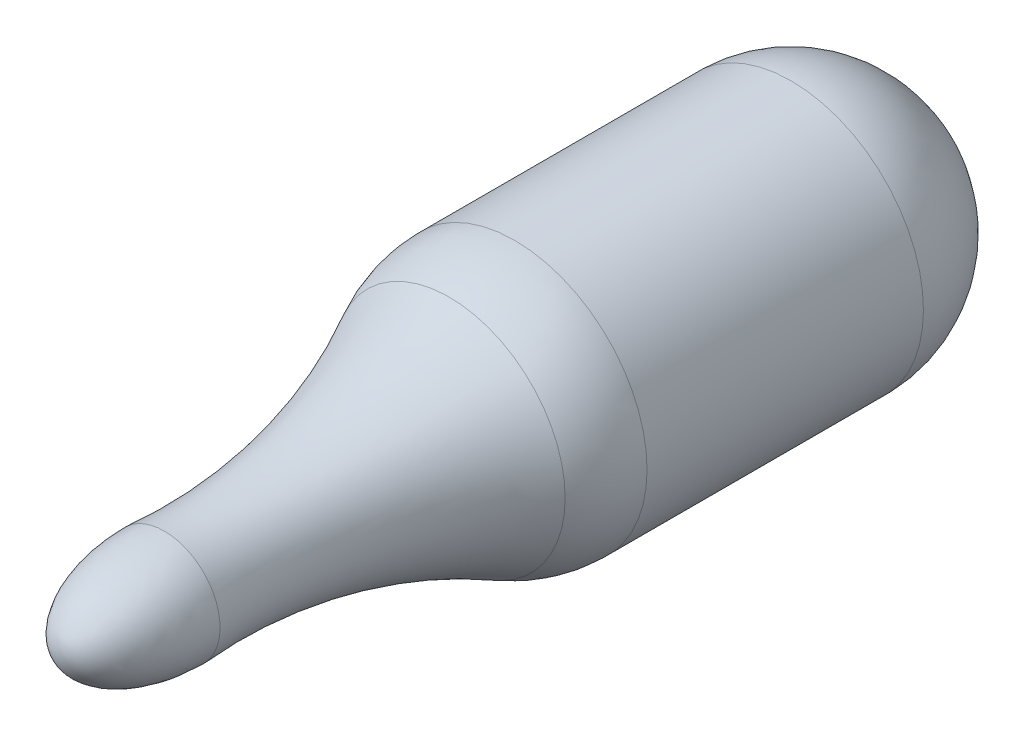
ISO-10303-21;
HEADER;
FILE_DESCRIPTION(('STEP AP214'),'2;1');
FILE_NAME('part.step','',(''),(''),'','','');
FILE_SCHEMA(('AUTOMOTIVE_DESIGN { 1 0 10303 214 1 1 1 1 }'));
ENDSEC;
DATA;
#1=APPLICATION_CONTEXT('core data for automotive mechanical design processes');
#2=APPLICATION_PROTOCOL_DEFINITION('international standard','automotive_design',2000,#1);
#3=PRODUCT_CONTEXT('',#1,'mechanical');
#4=PRODUCT('Part','Part','',(#3));
#5=PRODUCT_RELATED_PRODUCT_CATEGORY('part','',(#4));
#6=PRODUCT_DEFINITION_FORMATION('','',#4);
#7=PRODUCT_DEFINITION_CONTEXT('part definition',#1,'design');
#8=PRODUCT_DEFINITION('design','',#6,#7);
#9=PRODUCT_DEFINITION_SHAPE('','',#8);
#10=(LENGTH_UNIT() NAMED_UNIT(*) SI_UNIT(.MILLI.,.METRE.));
#11=(NAMED_UNIT(*) PLANE_ANGLE_UNIT() SI_UNIT($,.RADIAN.));
#12=(NAMED_UNIT(*) SI_UNIT($,.STERADIAN.) SOLID_ANGLE_UNIT());
#13=UNCERTAINTY_MEASURE_WITH_UNIT(LENGTH_MEASURE(1.E-05),#10,'distance_accuracy_value','');
#14=(GEOMETRIC_REPRESENTATION_CONTEXT(3) GLOBAL_UNCERTAINTY_ASSIGNED_CONTEXT((#13)) GLOBAL_UNIT_ASSIGNED_CONTEXT((#10,
#11,#12)) REPRESENTATION_CONTEXT('',''));
#15=CARTESIAN_POINT('',(0.,0.,0.));
#16=DIRECTION('',(0.,0.,1.));
#17=DIRECTION('',(1.,0.,0.));
#18=AXIS2_PLACEMENT_3D('',#15,#16,#17);
#19=CARTESIAN_POINT('',(0.,0.,-90.));
#20=DIRECTION('',(0.,0.,1.));
#21=DIRECTION('',(1.,0.,0.));
#22=AXIS2_PLACEMENT_3D('',#19,#20,#21);
#23=SPHERICAL_SURFACE('',#22,19.);
#24=CARTESIAN_POINT('',(0.,0.,-107.74881977137));
#25=DIRECTION('',(0.,0.,1.));
#26=DIRECTION('',(1.,0.,0.));
#27=AXIS2_PLACEMENT_3D('',#24,#25,#26);
#28=CIRCLE('',#27,6.78081091930951);
#29=CARTESIAN_POINT('',(6.78081091930955,0.,-107.74881977137));
#30=VERTEX_POINT('',#29);
#31=EDGE_CURVE('E67',#30,#30,#28,.T.);
#32=ORIENTED_EDGE('',*,*,#31,.T.);
#33=EDGE_LOOP('',(#32));
#34=FACE_BOUND('',#33,.T.);
#35=CARTESIAN_POINT('',(0.,0.,-90.));
#36=DIRECTION('',(0.,0.,1.));
#37=DIRECTION('',(1.,0.,0.));
#38=AXIS2_PLACEMENT_3D('',#35,#36,#37);
#39=CIRCLE('',#38,19.);
#40=CARTESIAN_POINT('',(19.0000000000001,0.,-90.));
#41=VERTEX_POINT('',#40);
#42=EDGE_CURVE('E64',#41,#41,#39,.T.);
#43=ORIENTED_EDGE('',*,*,#42,.F.);
#44=EDGE_LOOP('',(#43));
#45=FACE_BOUND('',#44,.T.);
#46=ADVANCED_FACE('F34',(#34,#45),#23,.T.);
#47=CARTESIAN_POINT('',(0.,0.,15.));
#48=DIRECTION('',(0.,0.,1.));
#49=DIRECTION('',(1.,0.,0.));
#50=AXIS2_PLACEMENT_3D('',#47,#48,#49);
#51=CYLINDRICAL_SURFACE('',#50,19.);
#52=CARTESIAN_POINT('',(0.,0.,-50.3125665758069));
#53=DIRECTION('',(0.,0.,1.));
#54=DIRECTION('',(1.,0.,0.));
#55=AXIS2_PLACEMENT_3D('',#52,#53,#54);
#56=CIRCLE('',#55,19.);
#57=CARTESIAN_POINT('',(19.0000000000001,0.,-50.3125665758069));
#58=VERTEX_POINT('',#57);
#59=EDGE_CURVE('E57',#58,#58,#56,.T.);
#60=ORIENTED_EDGE('',*,*,#59,.F.);
#61=EDGE_LOOP('',(#60));
#62=FACE_BOUND('',#61,.T.);
#63=ORIENTED_EDGE('',*,*,#42,.T.);
#64=EDGE_LOOP('',(#63));
#65=FACE_BOUND('',#64,.T.);
#66=ADVANCED_FACE('F104',(#62,#65),#51,.T.);
#67=CARTESIAN_POINT('',(0.,0.,-50.3125665758069));
#68=DIRECTION('',(0.,0.,1.));
#69=DIRECTION('',(1.,0.,0.));
#70=AXIS2_PLACEMENT_3D('',#67,#68,#69);
#71=DEGENERATE_TOROIDAL_SURFACE('',#70,1.00000000000001,20.,.F.);
#72=ORIENTED_EDGE('',*,*,#59,.T.);
#73=EDGE_LOOP('',(#72));
#74=FACE_BOUND('',#73,.T.);
#75=CARTESIAN_POINT('',(0.,0.,-40.9062367347893));
#76=DIRECTION('',(0.,0.,1.));
#77=DIRECTION('',(1.,0.,0.));
#78=AXIS2_PLACEMENT_3D('',#75,#76,#77);
#79=CIRCLE('',#78,16.6499563433449);
#80=CARTESIAN_POINT('',(16.649956343345,0.,-40.9062367347893));
#81=VERTEX_POINT('',#80);
#82=EDGE_CURVE('E54',#81,#81,#79,.T.);
#83=ORIENTED_EDGE('',*,*,#82,.F.);
#84=EDGE_LOOP('',(#83));
#85=FACE_BOUND('',#84,.T.);
#86=ADVANCED_FACE('F110',(#74,#85),#71,.F.);
#87=CARTESIAN_POINT('',(0.,0.,-5.55182150485176));
#88=DIRECTION('',(0.,0.,1.));
#89=DIRECTION('',(1.,0.,0.));
#90=AXIS2_PLACEMENT_3D('',#87,#88,#89);
#91=TOROIDAL_SURFACE('',#90,82.7942329192449,75.);
#92=ORIENTED_EDGE('',*,*,#82,.T.);
#93=EDGE_LOOP('',(#92));
#94=FACE_BOUND('',#93,.T.);
#95=CARTESIAN_POINT('',(0.,0.,0.));
#96=DIRECTION('',(0.,0.,1.));
#97=DIRECTION('',(1.,0.,0.));
#98=AXIS2_PLACEMENT_3D('',#95,#96,#97);
#99=CIRCLE('',#98,7.99999999999998);
#100=CARTESIAN_POINT('',(8.00000000000003,0.,0.));
#101=VERTEX_POINT('',#100);
#102=EDGE_CURVE('E52',#101,#101,#99,.T.);
#103=ORIENTED_EDGE('',*,*,#102,.F.);
#104=EDGE_LOOP('',(#103));
#105=FACE_BOUND('',#104,.T.);
#106=ADVANCED_FACE('F48',(#94,#105),#91,.F.);
#107=CARTESIAN_POINT('',(0.,0.,0.));
#108=DIRECTION('',(0.,1.,0.));
#109=DIRECTION('',(0.,0.,1.));
#110=AXIS2_PLACEMENT_3D('',#107,#108,#109);
#111=ELLIPSE('',#110,15.,8.);
#112=TRIMMED_CURVE('',#111,(PARAMETER_VALUE(3.14159265358979)),
(PARAMETER_VALUE(6.28318530717959)),.T.,.PARAMETER.);
#113=CARTESIAN_POINT('',(0.,0.,15.));
#114=DIRECTION('',(0.,0.,1.));
#115=AXIS1_PLACEMENT('',#113,#114);
#116=SURFACE_OF_REVOLUTION('',#112,#115);
#117=CARTESIAN_POINT('',(0.,0.,15.));
#118=VERTEX_POINT('',#117);
#119=VERTEX_LOOP('',#118);
#120=FACE_BOUND('',#119,.T.);
#121=ORIENTED_EDGE('',*,*,#102,.T.);
#122=EDGE_LOOP('',(#121));
#123=FACE_BOUND('',#122,.T.);
#124=ADVANCED_FACE('F44',(#120,#123),#116,.T.);
#125=CARTESIAN_POINT('',(0.,0.,-109.));
#126=DIRECTION('',(0.,0.,1.));
#127=DIRECTION('',(1.,0.,0.));
#128=AXIS2_PLACEMENT_3D('',#125,#126,#127);
#129=CYLINDRICAL_SURFACE('',#128,6.35);
#130=CARTESIAN_POINT('',(0.,0.,-107.452227651506));
#131=DIRECTION('',(0.,0.,1.));
#132=DIRECTION('',(1.,0.,0.));
#133=AXIS2_PLACEMENT_3D('',#130,#131,#132);
#134=CIRCLE('',#133,6.35);
#135=CARTESIAN_POINT('',(6.35000000000003,0.,-107.452227651506));
#136=VERTEX_POINT('',#135);
#137=EDGE_CURVE('E73',#136,#136,#134,.F.);
#138=ORIENTED_EDGE('',*,*,#137,.T.);
#139=EDGE_LOOP('',(#138));
#140=FACE_BOUND('',#139,.T.);
#141=CARTESIAN_POINT('',(0.,0.,-68.1775));
#142=DIRECTION('',(0.,0.,-1.));
#143=DIRECTION('',(-1.,0.,0.));
#144=AXIS2_PLACEMENT_3D('',#141,#142,#143);
#145=CIRCLE('',#144,6.35);
#146=CARTESIAN_POINT('',(-6.35000000000003,0.,-68.1775));
#147=VERTEX_POINT('',#146);
#148=EDGE_CURVE('E70',#147,#147,#145,.F.);
#149=ORIENTED_EDGE('',*,*,#148,.T.);
#150=EDGE_LOOP('',(#149));
#151=FACE_BOUND('',#150,.T.);
#152=ADVANCED_FACE('F47',(#140,#151),#129,.F.);
#153=CARTESIAN_POINT('',(0.,0.,-67.86));
#154=DIRECTION('',(0.,0.,-1.));
#155=DIRECTION('',(-1.,0.,0.));
#156=AXIS2_PLACEMENT_3D('',#153,#154,#155);
#157=PLANE('',#156);
#158=CARTESIAN_POINT('',(0.,0.,-67.86));
#159=DIRECTION('',(0.,0.,-1.));
#160=DIRECTION('',(-1.,0.,0.));
#161=AXIS2_PLACEMENT_3D('',#158,#159,#160);
#162=CIRCLE('',#161,6.0325);
#163=CARTESIAN_POINT('',(-6.03250000000003,0.,-67.86));
#164=VERTEX_POINT('',#163);
#165=EDGE_CURVE('E79',#164,#164,#162,.T.);
#166=ORIENTED_EDGE('',*,*,#165,.T.);
#167=EDGE_LOOP('',(#166));
#168=FACE_BOUND('',#167,.T.);
#169=CARTESIAN_POINT('',(0.,0.,-67.86));
#170=DIRECTION('',(0.,0.,-1.));
#171=DIRECTION('',(-1.,0.,0.));
#172=AXIS2_PLACEMENT_3D('',#169,#170,#171);
#173=CIRCLE('',#172,5.08);
#174=CARTESIAN_POINT('',(-5.08000000000003,0.,-67.86));
#175=VERTEX_POINT('',#174);
#176=EDGE_CURVE('E76',#175,#175,#173,.F.);
#177=ORIENTED_EDGE('',*,*,#176,.T.);
#178=EDGE_LOOP('',(#177));
#179=FACE_BOUND('',#178,.T.);
#180=ADVANCED_FACE('F130',(#168,#179),#157,.T.);
#181=CARTESIAN_POINT('',(0.,0.,-67.86));
#182=DIRECTION('',(0.,0.,1.));
#183=DIRECTION('',(1.,0.,0.));
#184=AXIS2_PLACEMENT_3D('',#181,#182,#183);
#185=CYLINDRICAL_SURFACE('',#184,4.7625);
#186=CARTESIAN_POINT('',(0.,0.,-67.5425));
#187=DIRECTION('',(0.,0.,-1.));
#188=DIRECTION('',(-1.,0.,0.));
#189=AXIS2_PLACEMENT_3D('',#186,#187,#188);
#190=CIRCLE('',#189,4.7625);
#191=CARTESIAN_POINT('',(-4.76250000000002,0.,-67.5425));
#192=VERTEX_POINT('',#191);
#193=EDGE_CURVE('E41',#192,#192,#190,.T.);
#194=ORIENTED_EDGE('',*,*,#193,.T.);
#195=EDGE_LOOP('',(#194));
#196=FACE_BOUND('',#195,.T.);
#197=CARTESIAN_POINT('',(0.,0.,-45.3175));
#198=DIRECTION('',(0.,0.,1.));
#199=DIRECTION('',(1.,0.,0.));
#200=AXIS2_PLACEMENT_3D('',#197,#198,#199);
#201=CIRCLE('',#200,4.7625);
#202=CARTESIAN_POINT('',(4.76250000000002,0.,-45.3175));
#203=VERTEX_POINT('',#202);
#204=EDGE_CURVE('E82',#203,#203,#201,.T.);
#205=ORIENTED_EDGE('',*,*,#204,.T.);
#206=EDGE_LOOP('',(#205));
#207=FACE_BOUND('',#206,.T.);
#208=ADVANCED_FACE('F87',(#196,#207),#185,.F.);
#209=CARTESIAN_POINT('',(0.,0.,-45.));
#210=DIRECTION('',(0.,0.,1.));
#211=DIRECTION('',(1.,0.,0.));
#212=AXIS2_PLACEMENT_3D('',#209,#210,#211);
#213=PLANE('',#212);
#214=CARTESIAN_POINT('',(0.,0.,-45.));
#215=DIRECTION('',(0.,0.,1.));
#216=DIRECTION('',(1.,0.,0.));
#217=AXIS2_PLACEMENT_3D('',#214,#215,#216);
#218=CIRCLE('',#217,4.445);
#219=CARTESIAN_POINT('',(4.44500000000002,0.,-45.));
#220=VERTEX_POINT('',#219);
#221=EDGE_CURVE('E11',#220,#220,#218,.F.);
#222=ORIENTED_EDGE('',*,*,#221,.T.);
#223=EDGE_LOOP('',(#222));
#224=FACE_BOUND('',#223,.T.);
#225=ADVANCED_FACE('F117',(#224),#213,.F.);
#226=CARTESIAN_POINT('',(0.,0.,-107.452227651506));
#227=DIRECTION('',(0.,0.,1.));
#228=DIRECTION('',(1.,0.,0.));
#229=AXIS2_PLACEMENT_3D('',#226,#227,#228);
#230=TOROIDAL_SURFACE('',#229,6.6675,0.3175);
#231=ORIENTED_EDGE('',*,*,#137,.F.);
#232=EDGE_LOOP('',(#231));
#233=FACE_BOUND('',#232,.T.);
#234=ORIENTED_EDGE('',*,*,#31,.F.);
#235=EDGE_LOOP('',(#234));
#236=FACE_BOUND('',#235,.T.);
#237=ADVANCED_FACE('F99',(#233,#236),#230,.T.);
#238=CARTESIAN_POINT('',(0.,0.,-68.1775));
#239=DIRECTION('',(0.,0.,-1.));
#240=DIRECTION('',(-1.,0.,0.));
#241=AXIS2_PLACEMENT_3D('',#238,#239,#240);
#242=TOROIDAL_SURFACE('',#241,6.0325,0.3175);
#243=ORIENTED_EDGE('',*,*,#148,.F.);
#244=EDGE_LOOP('',(#243));
#245=FACE_BOUND('',#244,.T.);
#246=ORIENTED_EDGE('',*,*,#165,.F.);
#247=EDGE_LOOP('',(#246));
#248=FACE_BOUND('',#247,.T.);
#249=ADVANCED_FACE('F92',(#245,#248),#242,.F.);
#250=CARTESIAN_POINT('',(0.,0.,-67.5425));
#251=DIRECTION('',(0.,0.,-1.));
#252=DIRECTION('',(-1.,0.,0.));
#253=AXIS2_PLACEMENT_3D('',#250,#251,#252);
#254=TOROIDAL_SURFACE('',#253,5.08,0.3175);
#255=ORIENTED_EDGE('',*,*,#176,.F.);
#256=EDGE_LOOP('',(#255));
#257=FACE_BOUND('',#256,.T.);
#258=ORIENTED_EDGE('',*,*,#193,.F.);
#259=EDGE_LOOP('',(#258));
#260=FACE_BOUND('',#259,.T.);
#261=ADVANCED_FACE('F90',(#257,#260),#254,.T.);
#262=CARTESIAN_POINT('',(0.,0.,-45.3175));
#263=DIRECTION('',(0.,0.,1.));
#264=DIRECTION('',(1.,0.,0.));
#265=AXIS2_PLACEMENT_3D('',#262,#263,#264);
#266=TOROIDAL_SURFACE('',#265,4.445,0.3175);
#267=ORIENTED_EDGE('',*,*,#204,.F.);
#268=EDGE_LOOP('',(#267));
#269=FACE_BOUND('',#268,.T.);
#270=ORIENTED_EDGE('',*,*,#221,.F.);
#271=EDGE_LOOP('',(#270));
#272=FACE_BOUND('',#271,.T.);
#273=ADVANCED_FACE('F36',(#269,#272),#266,.F.);
#274=CLOSED_SHELL('',(#46,#66,#86,#106,#124,#152,#180,#208,#225,#237,#249,#261,#273));
#275=MANIFOLD_SOLID_BREP('B2',#274);
#276=ADVANCED_BREP_SHAPE_REPRESENTATION('',(#18,#275),#14);
#277=SHAPE_DEFINITION_REPRESENTATION(#9,#276);
ENDSEC;
END-ISO-10303-21;
